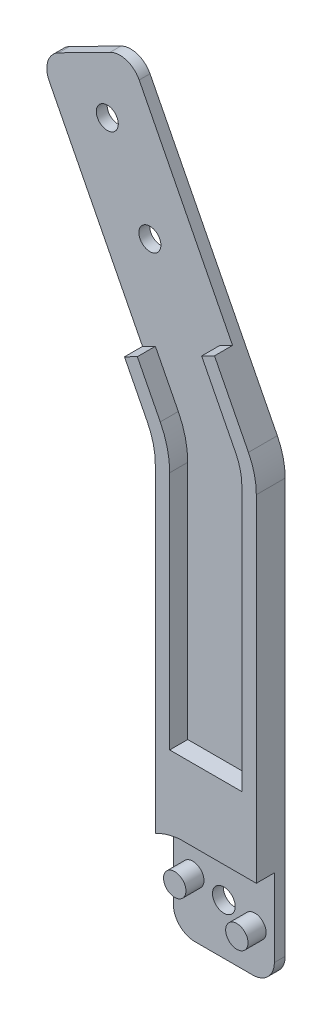
ISO-10303-21;
HEADER;
FILE_DESCRIPTION(('STEP AP214'),'2;1');
FILE_NAME('part.step','',(''),(''),'','','');
FILE_SCHEMA(('AUTOMOTIVE_DESIGN { 1 0 10303 214 1 1 1 1 }'));
ENDSEC;
DATA;
#1=APPLICATION_CONTEXT('core data for automotive mechanical design processes');
#2=APPLICATION_PROTOCOL_DEFINITION('international standard','automotive_design',2000,#1);
#3=PRODUCT_CONTEXT('',#1,'mechanical');
#4=PRODUCT('Part','Part','',(#3));
#5=PRODUCT_RELATED_PRODUCT_CATEGORY('part','',(#4));
#6=PRODUCT_DEFINITION_FORMATION('','',#4);
#7=PRODUCT_DEFINITION_CONTEXT('part definition',#1,'design');
#8=PRODUCT_DEFINITION('design','',#6,#7);
#9=PRODUCT_DEFINITION_SHAPE('','',#8);
#10=(LENGTH_UNIT() NAMED_UNIT(*) SI_UNIT(.MILLI.,.METRE.));
#11=(NAMED_UNIT(*) PLANE_ANGLE_UNIT() SI_UNIT($,.RADIAN.));
#12=(NAMED_UNIT(*) SI_UNIT($,.STERADIAN.) SOLID_ANGLE_UNIT());
#13=UNCERTAINTY_MEASURE_WITH_UNIT(LENGTH_MEASURE(1.E-05),#10,'distance_accuracy_value','');
#14=(GEOMETRIC_REPRESENTATION_CONTEXT(3) GLOBAL_UNCERTAINTY_ASSIGNED_CONTEXT((#13)) GLOBAL_UNIT_ASSIGNED_CONTEXT((#10,
#11,#12)) REPRESENTATION_CONTEXT('',''));
#15=CARTESIAN_POINT('',(0.,0.,0.));
#16=DIRECTION('',(0.,0.,1.));
#17=DIRECTION('',(1.,0.,0.));
#18=AXIS2_PLACEMENT_3D('',#15,#16,#17);
#19=CARTESIAN_POINT('',(0.,0.,1.5));
#20=DIRECTION('',(0.,0.,1.));
#21=DIRECTION('',(1.,0.,0.));
#22=AXIS2_PLACEMENT_3D('',#19,#20,#21);
#23=PLANE('',#22);
#24=CARTESIAN_POINT('',(22.138759595552,51.4926729580468,1.5));
#25=DIRECTION('',(0.,0.,1.));
#26=DIRECTION('',(1.,0.,0.));
#27=AXIS2_PLACEMENT_3D('',#24,#25,#26);
#28=CIRCLE('',#27,1.55);
#29=CARTESIAN_POINT('',(23.688759595552,51.4926729580468,1.5));
#30=VERTEX_POINT('',#29);
#31=EDGE_CURVE('E226',#30,#30,#28,.T.);
#32=ORIENTED_EDGE('',*,*,#31,.F.);
#33=EDGE_LOOP('',(#32));
#34=FACE_BOUND('',#33,.T.);
#35=CARTESIAN_POINT('',(17.8354501109085,52.4568448718525,1.5));
#36=DIRECTION('',(0.,0.,1.));
#37=DIRECTION('',(1.,0.,0.));
#38=AXIS2_PLACEMENT_3D('',#35,#36,#37);
#39=CIRCLE('',#38,1.575);
#40=CARTESIAN_POINT('',(19.4104501109085,52.4568448718525,1.5));
#41=VERTEX_POINT('',#40);
#42=EDGE_CURVE('E256',#41,#41,#39,.T.);
#43=ORIENTED_EDGE('',*,*,#42,.F.);
#44=EDGE_LOOP('',(#43));
#45=FACE_BOUND('',#44,.T.);
#46=CARTESIAN_POINT('',(13.5321406262647,53.4210167856623,1.5));
#47=DIRECTION('',(0.,0.,1.));
#48=DIRECTION('',(1.,0.,0.));
#49=AXIS2_PLACEMENT_3D('',#46,#47,#48);
#50=CIRCLE('',#49,1.55);
#51=CARTESIAN_POINT('',(15.0821406262647,53.4210167856623,1.5));
#52=VERTEX_POINT('',#51);
#53=EDGE_CURVE('E236',#52,#52,#50,.T.);
#54=ORIENTED_EDGE('',*,*,#53,.F.);
#55=EDGE_LOOP('',(#54));
#56=FACE_BOUND('',#55,.T.);
#57=DIRECTION('',(1.,0.,0.));
#58=VECTOR('',#57,1.);
#59=CARTESIAN_POINT('',(24.8354501109084,59.2171124506115,1.5));
#60=LINE('',#59,#58);
#61=CARTESIAN_POINT('',(14.4020012026477,59.2171124506115,1.5));
#62=VERTEX_POINT('',#61);
#63=CARTESIAN_POINT('',(24.8354501109084,59.2171124506115,1.5));
#64=VERTEX_POINT('',#63);
#65=EDGE_CURVE('E50',#62,#64,#60,.T.);
#66=ORIENTED_EDGE('',*,*,#65,.F.);
#67=CARTESIAN_POINT('',(9.53918293556798,51.6023980939841,1.5));
#68=CARTESIAN_POINT('',(8.76047999316748,53.1041844823436,1.5));
#69=CARTESIAN_POINT('',(8.32344941307515,57.7615216555177,1.5));
#70=CARTESIAN_POINT('',(12.7412601634902,59.13858236446,1.5));
#71=CARTESIAN_POINT('',(14.4020012026477,59.2171124506115,1.5));
#72=B_SPLINE_CURVE_WITH_KNOTS('',3,(#67,#68,#69,#70,#71),.UNSPECIFIED.,.F.,.F.,(4,1,4),(0.,
0.50050792490168,1.),.UNSPECIFIED.);
#73=CARTESIAN_POINT('',(10.8354501109083,58.1623408521615,1.5));
#74=VERTEX_POINT('',#73);
#75=EDGE_CURVE('E225',#74,#62,#72,.T.);
#76=ORIENTED_EDGE('',*,*,#75,.F.);
#77=DIRECTION('',(0.,-1.,0.));
#78=VECTOR('',#77,1.);
#79=CARTESIAN_POINT('',(10.8354501109083,45.4568448718525,1.5));
#80=LINE('',#79,#78);
#81=CARTESIAN_POINT('',(10.8354501109083,48.4568448718526,1.5));
#82=VERTEX_POINT('',#81);
#83=EDGE_CURVE('E275',#74,#82,#80,.T.);
#84=ORIENTED_EDGE('',*,*,#83,.T.);
#85=CARTESIAN_POINT('',(13.8354501109083,48.4568448718526,1.5));
#86=DIRECTION('',(0.,0.,1.));
#87=DIRECTION('',(1.,0.,0.));
#88=AXIS2_PLACEMENT_3D('',#85,#86,#87);
#89=CIRCLE('',#88,3.);
#90=CARTESIAN_POINT('',(13.8354501109084,45.4568448718526,1.5));
#91=VERTEX_POINT('',#90);
#92=EDGE_CURVE('E329',#82,#91,#89,.T.);
#93=ORIENTED_EDGE('',*,*,#92,.T.);
#94=DIRECTION('',(1.,0.,0.));
#95=VECTOR('',#94,1.);
#96=CARTESIAN_POINT('',(10.8354501109083,45.4568448718525,1.5));
#97=LINE('',#96,#95);
#98=CARTESIAN_POINT('',(21.8354501109085,45.4568448718527,1.5));
#99=VERTEX_POINT('',#98);
#100=EDGE_CURVE('E262',#91,#99,#97,.T.);
#101=ORIENTED_EDGE('',*,*,#100,.T.);
#102=CARTESIAN_POINT('',(21.8354501109084,48.4568448718527,1.5));
#103=DIRECTION('',(0.,0.,1.));
#104=DIRECTION('',(1.,0.,0.));
#105=AXIS2_PLACEMENT_3D('',#102,#103,#104);
#106=CIRCLE('',#105,3.);
#107=CARTESIAN_POINT('',(24.8354501109084,48.4568448718527,1.5));
#108=VERTEX_POINT('',#107);
#109=EDGE_CURVE('E331',#99,#108,#106,.T.);
#110=ORIENTED_EDGE('',*,*,#109,.T.);
#111=DIRECTION('',(0.,1.,0.));
#112=VECTOR('',#111,1.);
#113=CARTESIAN_POINT('',(24.8354501109084,45.4568448718528,1.5));
#114=LINE('',#113,#112);
#115=EDGE_CURVE('E265',#108,#64,#114,.T.);
#116=ORIENTED_EDGE('',*,*,#115,.T.);
#117=EDGE_LOOP('',(#66,#76,#84,#93,#101,#110,#116));
#118=FACE_BOUND('',#117,.T.);
#119=ADVANCED_FACE('F35',(#34,#45,#56,#118),#23,.T.);
#120=CARTESIAN_POINT('',(7.59061625738334,126.665302464628,1.5));
#121=DIRECTION('',(0.,0.,1.));
#122=DIRECTION('',(1.,0.,0.));
#123=AXIS2_PLACEMENT_3D('',#120,#121,#122);
#124=CIRCLE('',#123,1.52499999999986);
#125=CARTESIAN_POINT('',(9.1156162573832,126.665302464628,1.5));
#126=VERTEX_POINT('',#125);
#127=EDGE_CURVE('E244',#126,#126,#124,.T.);
#128=ORIENTED_EDGE('',*,*,#127,.F.);
#129=EDGE_LOOP('',(#128));
#130=FACE_BOUND('',#129,.T.);
#131=CARTESIAN_POINT('',(1.68873976076937,138.248387279077,1.5));
#132=DIRECTION('',(0.,0.,1.));
#133=DIRECTION('',(1.,0.,0.));
#134=AXIS2_PLACEMENT_3D('',#131,#132,#133);
#135=CIRCLE('',#134,1.52499999999995);
#136=CARTESIAN_POINT('',(3.21373976076932,138.248387279077,1.5));
#137=VERTEX_POINT('',#136);
#138=EDGE_CURVE('E250',#137,#137,#135,.T.);
#139=ORIENTED_EDGE('',*,*,#138,.F.);
#140=EDGE_LOOP('',(#139));
#141=FACE_BOUND('',#140,.T.);
#142=DIRECTION('',(0.453990499739536,-0.891006524188374,0.));
#143=VECTOR('',#142,1.);
#144=CARTESIAN_POINT('',(21.9635023044154,109.47037163722,1.5));
#145=LINE('',#144,#143);
#146=CARTESIAN_POINT('',(17.2596601448759,118.702181675771,1.5));
#147=VERTEX_POINT('',#146);
#148=CARTESIAN_POINT('',(21.9635023044154,109.47037163722,1.5));
#149=VERTEX_POINT('',#148);
#150=EDGE_CURVE('E58',#147,#149,#145,.T.);
#151=ORIENTED_EDGE('',*,*,#150,.F.);
#152=DIRECTION('',(-0.891006524188373,-0.453990499739537,0.));
#153=VECTOR('',#152,1.);
#154=CARTESIAN_POINT('',(17.2596601448759,118.702181675771,1.5));
#155=LINE('',#154,#153);
#156=CARTESIAN_POINT('',(19.0416731932526,119.61016267525,1.5));
#157=VERTEX_POINT('',#156);
#158=EDGE_CURVE('E386',#157,#147,#155,.T.);
#159=ORIENTED_EDGE('',*,*,#158,.F.);
#160=DIRECTION('',(-0.453990499739536,0.891006524188373,0.));
#161=VECTOR('',#160,1.);
#162=CARTESIAN_POINT('',(4.74785193191127,147.663366446572,1.5));
#163=LINE('',#162,#161);
#164=CARTESIAN_POINT('',(6.10982343112988,144.990346874007,1.5));
#165=VERTEX_POINT('',#164);
#166=EDGE_CURVE('E268',#157,#165,#163,.T.);
#167=ORIENTED_EDGE('',*,*,#166,.T.);
#168=CARTESIAN_POINT('',(3.43680385856476,143.628375374789,1.5));
#169=DIRECTION('',(0.,0.,1.));
#170=DIRECTION('',(1.,0.,0.));
#171=AXIS2_PLACEMENT_3D('',#168,#169,#170);
#172=CIRCLE('',#171,3.);
#173=CARTESIAN_POINT('',(2.07483235934615,146.301394947354,1.5));
#174=VERTEX_POINT('',#173);
#175=EDGE_CURVE('E325',#165,#174,#172,.T.);
#176=ORIENTED_EDGE('',*,*,#175,.T.);
#177=DIRECTION('',(-0.891006524188373,-0.453990499739537,0.));
#178=VECTOR('',#177,1.);
#179=CARTESIAN_POINT('',(-7.72623940672607,141.307499450219,1.5));
#180=LINE('',#179,#178);
#181=CARTESIAN_POINT('',(-5.05321983416097,142.669470949437,1.5));
#182=VERTEX_POINT('',#181);
#183=EDGE_CURVE('E270',#174,#182,#180,.T.);
#184=ORIENTED_EDGE('',*,*,#183,.T.);
#185=CARTESIAN_POINT('',(-3.69124833494234,139.996451376872,1.5));
#186=DIRECTION('',(0.,0.,1.));
#187=DIRECTION('',(1.,0.,0.));
#188=AXIS2_PLACEMENT_3D('',#185,#186,#187);
#189=CIRCLE('',#188,3.);
#190=CARTESIAN_POINT('',(-6.36426790750746,138.634479877654,1.5));
#191=VERTEX_POINT('',#190);
#192=EDGE_CURVE('E327',#182,#191,#189,.T.);
#193=ORIENTED_EDGE('',*,*,#192,.T.);
#194=DIRECTION('',(0.453990499739536,-0.891006524188373,0.));
#195=VECTOR('',#194,1.);
#196=CARTESIAN_POINT('',(-7.72623940672607,141.307499450219,1.5));
#197=LINE('',#196,#195);
#198=CARTESIAN_POINT('',(6.56758185461529,113.254295678896,1.5));
#199=VERTEX_POINT('',#198);
#200=EDGE_CURVE('E273',#191,#199,#197,.T.);
#201=ORIENTED_EDGE('',*,*,#200,.T.);
#202=DIRECTION('',(-0.891006524188374,-0.453990499739535,0.));
#203=VECTOR('',#202,1.);
#204=CARTESIAN_POINT('',(6.5675818546153,113.254295678896,1.5));
#205=LINE('',#204,#203);
#206=CARTESIAN_POINT('',(8.34959490299204,114.162276678376,1.5));
#207=VERTEX_POINT('',#206);
#208=EDGE_CURVE('E222',#207,#199,#205,.T.);
#209=ORIENTED_EDGE('',*,*,#208,.F.);
#210=DIRECTION('',(-0.453990499739535,0.891006524188374,0.));
#211=VECTOR('',#210,1.);
#212=CARTESIAN_POINT('',(8.34959490299205,114.162276678376,1.5));
#213=LINE('',#212,#211);
#214=CARTESIAN_POINT('',(11.5275284011688,107.925231009057,1.5));
#215=VERTEX_POINT('',#214);
#216=EDGE_CURVE('E404',#215,#207,#213,.T.);
#217=ORIENTED_EDGE('',*,*,#216,.F.);
#218=CARTESIAN_POINT('',(0.835450110908313,102.477345012182,1.5));
#219=DIRECTION('',(0.,0.,1.));
#220=DIRECTION('',(1.,0.,0.));
#221=AXIS2_PLACEMENT_3D('',#218,#219,#220);
#222=CIRCLE('',#221,12.);
#223=CARTESIAN_POINT('',(12.8354501109083,102.477345012182,1.5));
#224=VERTEX_POINT('',#223);
#225=EDGE_CURVE('E401',#224,#215,#222,.T.);
#226=ORIENTED_EDGE('',*,*,#225,.F.);
#227=DIRECTION('',(0.,1.,0.));
#228=VECTOR('',#227,1.);
#229=CARTESIAN_POINT('',(12.8354501109083,102.477345012182,1.5));
#230=LINE('',#229,#228);
#231=CARTESIAN_POINT('',(12.8354501109083,69.2171124506115,1.5));
#232=VERTEX_POINT('',#231);
#233=EDGE_CURVE('E398',#232,#224,#230,.T.);
#234=ORIENTED_EDGE('',*,*,#233,.F.);
#235=DIRECTION('',(-1.,0.,0.));
#236=VECTOR('',#235,1.);
#237=CARTESIAN_POINT('',(12.8354501109083,69.2171124506115,1.5));
#238=LINE('',#237,#236);
#239=CARTESIAN_POINT('',(22.8354501109084,69.2171124506115,1.5));
#240=VERTEX_POINT('',#239);
#241=EDGE_CURVE('E395',#240,#232,#238,.T.);
#242=ORIENTED_EDGE('',*,*,#241,.F.);
#243=DIRECTION('',(0.,-1.,0.));
#244=VECTOR('',#243,1.);
#245=CARTESIAN_POINT('',(22.8354501109084,69.2171124506115,1.5));
#246=LINE('',#245,#244);
#247=CARTESIAN_POINT('',(22.8354501109084,105.838447639304,1.5));
#248=VERTEX_POINT('',#247);
#249=EDGE_CURVE('E392',#248,#240,#246,.T.);
#250=ORIENTED_EDGE('',*,*,#249,.F.);
#251=CARTESIAN_POINT('',(14.8354501109084,105.838447639304,1.5));
#252=DIRECTION('',(0.,0.,-1.));
#253=DIRECTION('',(1.,0.,0.));
#254=AXIS2_PLACEMENT_3D('',#251,#252,#253);
#255=CIRCLE('',#254,8.);
#256=EDGE_CURVE('E389',#149,#248,#255,.T.);
#257=ORIENTED_EDGE('',*,*,#256,.F.);
#258=EDGE_LOOP('',(#151,#159,#167,#176,#184,#193,#201,#209,#217,#226,#234,#242,#250,#257));
#259=FACE_BOUND('',#258,.T.);
#260=ADVANCED_FACE('F348',(#130,#141,#259),#23,.T.);
#261=CARTESIAN_POINT('',(0.,0.,0.));
#262=DIRECTION('',(0.,0.,1.));
#263=DIRECTION('',(1.,0.,0.));
#264=AXIS2_PLACEMENT_3D('',#261,#262,#263);
#265=PLANE('',#264);
#266=CARTESIAN_POINT('',(1.68873976076937,138.248387279077,0.));
#267=DIRECTION('',(0.,0.,1.));
#268=DIRECTION('',(1.,0.,0.));
#269=AXIS2_PLACEMENT_3D('',#266,#267,#268);
#270=CIRCLE('',#269,1.52499999999995);
#271=CARTESIAN_POINT('',(3.21373976076932,138.248387279077,0.));
#272=VERTEX_POINT('',#271);
#273=EDGE_CURVE('E247',#272,#272,#270,.T.);
#274=ORIENTED_EDGE('',*,*,#273,.T.);
#275=EDGE_LOOP('',(#274));
#276=FACE_BOUND('',#275,.T.);
#277=DIRECTION('',(-0.453990499739536,0.891006524188373,0.));
#278=VECTOR('',#277,1.);
#279=CARTESIAN_POINT('',(4.74785193191127,147.663366446572,0.));
#280=LINE('',#279,#278);
#281=CARTESIAN_POINT('',(23.7455153527922,110.378352636699,0.));
#282=VERTEX_POINT('',#281);
#283=CARTESIAN_POINT('',(6.10982343112988,144.990346874007,0.));
#284=VERTEX_POINT('',#283);
#285=EDGE_CURVE('E283',#282,#284,#280,.T.);
#286=ORIENTED_EDGE('',*,*,#285,.F.);
#287=CARTESIAN_POINT('',(14.8354501109084,105.838447639304,0.));
#288=DIRECTION('',(0.,0.,1.));
#289=DIRECTION('',(1.,0.,0.));
#290=AXIS2_PLACEMENT_3D('',#287,#288,#289);
#291=CIRCLE('',#290,10.);
#292=CARTESIAN_POINT('',(24.8354501109084,105.838447639304,0.));
#293=VERTEX_POINT('',#292);
#294=EDGE_CURVE('E318',#282,#293,#291,.F.);
#295=ORIENTED_EDGE('',*,*,#294,.T.);
#296=DIRECTION('',(0.,1.,0.));
#297=VECTOR('',#296,1.);
#298=CARTESIAN_POINT('',(24.8354501109084,45.4568448718528,0.));
#299=LINE('',#298,#297);
#300=CARTESIAN_POINT('',(24.8354501109084,48.4568448718527,0.));
#301=VERTEX_POINT('',#300);
#302=EDGE_CURVE('E280',#301,#293,#299,.T.);
#303=ORIENTED_EDGE('',*,*,#302,.F.);
#304=CARTESIAN_POINT('',(21.8354501109084,48.4568448718527,0.));
#305=DIRECTION('',(0.,0.,1.));
#306=DIRECTION('',(1.,0.,0.));
#307=AXIS2_PLACEMENT_3D('',#304,#305,#306);
#308=CIRCLE('',#307,3.);
#309=CARTESIAN_POINT('',(21.8354501109085,45.4568448718527,0.));
#310=VERTEX_POINT('',#309);
#311=EDGE_CURVE('E316',#301,#310,#308,.F.);
#312=ORIENTED_EDGE('',*,*,#311,.T.);
#313=DIRECTION('',(1.,0.,0.));
#314=VECTOR('',#313,1.);
#315=CARTESIAN_POINT('',(10.8354501109083,45.4568448718525,0.));
#316=LINE('',#315,#314);
#317=CARTESIAN_POINT('',(13.8354501109084,45.4568448718526,0.));
#318=VERTEX_POINT('',#317);
#319=EDGE_CURVE('E259',#318,#310,#316,.T.);
#320=ORIENTED_EDGE('',*,*,#319,.F.);
#321=CARTESIAN_POINT('',(13.8354501109083,48.4568448718526,0.));
#322=DIRECTION('',(0.,0.,1.));
#323=DIRECTION('',(1.,0.,0.));
#324=AXIS2_PLACEMENT_3D('',#321,#322,#323);
#325=CIRCLE('',#324,3.);
#326=CARTESIAN_POINT('',(10.8354501109083,48.4568448718526,0.));
#327=VERTEX_POINT('',#326);
#328=EDGE_CURVE('E314',#318,#327,#325,.F.);
#329=ORIENTED_EDGE('',*,*,#328,.T.);
#330=DIRECTION('',(0.,-1.,0.));
#331=VECTOR('',#330,1.);
#332=CARTESIAN_POINT('',(10.8354501109083,45.4568448718525,0.));
#333=LINE('',#332,#331);
#334=CARTESIAN_POINT('',(10.8354501109083,102.477345012182,0.));
#335=VERTEX_POINT('',#334);
#336=EDGE_CURVE('E266',#335,#327,#333,.T.);
#337=ORIENTED_EDGE('',*,*,#336,.F.);
#338=CARTESIAN_POINT('',(0.835450110908313,102.477345012182,0.));
#339=DIRECTION('',(0.,0.,1.));
#340=DIRECTION('',(1.,0.,0.));
#341=AXIS2_PLACEMENT_3D('',#338,#339,#340);
#342=CIRCLE('',#341,10.);
#343=CARTESIAN_POINT('',(9.74551535279205,107.017250009578,0.));
#344=VERTEX_POINT('',#343);
#345=EDGE_CURVE('E12',#335,#344,#342,.T.);
#346=ORIENTED_EDGE('',*,*,#345,.T.);
#347=DIRECTION('',(0.453990499739536,-0.891006524188373,0.));
#348=VECTOR('',#347,1.);
#349=CARTESIAN_POINT('',(-7.72623940672607,141.307499450219,0.));
#350=LINE('',#349,#348);
#351=CARTESIAN_POINT('',(-6.36426790750746,138.634479877654,0.));
#352=VERTEX_POINT('',#351);
#353=EDGE_CURVE('E289',#352,#344,#350,.T.);
#354=ORIENTED_EDGE('',*,*,#353,.F.);
#355=CARTESIAN_POINT('',(-3.69124833494234,139.996451376872,0.));
#356=DIRECTION('',(0.,0.,1.));
#357=DIRECTION('',(1.,0.,0.));
#358=AXIS2_PLACEMENT_3D('',#355,#356,#357);
#359=CIRCLE('',#358,3.);
#360=CARTESIAN_POINT('',(-5.05321983416097,142.669470949437,0.));
#361=VERTEX_POINT('',#360);
#362=EDGE_CURVE('E312',#352,#361,#359,.F.);
#363=ORIENTED_EDGE('',*,*,#362,.T.);
#364=DIRECTION('',(-0.891006524188373,-0.453990499739537,0.));
#365=VECTOR('',#364,1.);
#366=CARTESIAN_POINT('',(-7.72623940672607,141.307499450219,0.));
#367=LINE('',#366,#365);
#368=CARTESIAN_POINT('',(2.07483235934615,146.301394947354,0.));
#369=VERTEX_POINT('',#368);
#370=EDGE_CURVE('E286',#369,#361,#367,.T.);
#371=ORIENTED_EDGE('',*,*,#370,.F.);
#372=CARTESIAN_POINT('',(3.43680385856476,143.628375374789,0.));
#373=DIRECTION('',(0.,0.,1.));
#374=DIRECTION('',(1.,0.,0.));
#375=AXIS2_PLACEMENT_3D('',#372,#373,#374);
#376=CIRCLE('',#375,3.);
#377=EDGE_CURVE('E310',#369,#284,#376,.F.);
#378=ORIENTED_EDGE('',*,*,#377,.T.);
#379=EDGE_LOOP('',(#286,#295,#303,#312,#320,#329,#337,#346,#354,#363,#371,#378));
#380=FACE_BOUND('',#379,.T.);
#381=CARTESIAN_POINT('',(17.8354501109085,52.4568448718525,0.));
#382=DIRECTION('',(0.,0.,1.));
#383=DIRECTION('',(1.,0.,0.));
#384=AXIS2_PLACEMENT_3D('',#381,#382,#383);
#385=CIRCLE('',#384,1.575);
#386=CARTESIAN_POINT('',(19.4104501109085,52.4568448718525,0.));
#387=VERTEX_POINT('',#386);
#388=EDGE_CURVE('E253',#387,#387,#385,.T.);
#389=ORIENTED_EDGE('',*,*,#388,.T.);
#390=EDGE_LOOP('',(#389));
#391=FACE_BOUND('',#390,.T.);
#392=CARTESIAN_POINT('',(7.59061625738334,126.665302464628,0.));
#393=DIRECTION('',(0.,0.,1.));
#394=DIRECTION('',(1.,0.,0.));
#395=AXIS2_PLACEMENT_3D('',#392,#393,#394);
#396=CIRCLE('',#395,1.52499999999986);
#397=CARTESIAN_POINT('',(9.1156162573832,126.665302464628,0.));
#398=VERTEX_POINT('',#397);
#399=EDGE_CURVE('E241',#398,#398,#396,.T.);
#400=ORIENTED_EDGE('',*,*,#399,.T.);
#401=EDGE_LOOP('',(#400));
#402=FACE_BOUND('',#401,.T.);
#403=ADVANCED_FACE('F360',(#276,#380,#391,#402),#265,.F.);
#404=CARTESIAN_POINT('',(10.8354501109083,45.4568448718525,1.5));
#405=DIRECTION('',(0.,1.,0.));
#406=DIRECTION('',(-1.,0.,0.));
#407=AXIS2_PLACEMENT_3D('',#404,#405,#406);
#408=PLANE('',#407);
#409=ORIENTED_EDGE('',*,*,#319,.T.);
#410=DIRECTION('',(0.,0.,-1.));
#411=VECTOR('',#410,1.);
#412=CARTESIAN_POINT('',(21.8354501109085,45.4568448718527,1.5));
#413=LINE('',#412,#411);
#414=EDGE_CURVE('E336',#310,#99,#413,.F.);
#415=ORIENTED_EDGE('',*,*,#414,.T.);
#416=ORIENTED_EDGE('',*,*,#100,.F.);
#417=DIRECTION('',(0.,0.,-1.));
#418=VECTOR('',#417,1.);
#419=CARTESIAN_POINT('',(13.8354501109084,45.4568448718526,1.5));
#420=LINE('',#419,#418);
#421=EDGE_CURVE('E333',#91,#318,#420,.T.);
#422=ORIENTED_EDGE('',*,*,#421,.T.);
#423=EDGE_LOOP('',(#409,#415,#416,#422));
#424=FACE_BOUND('',#423,.T.);
#425=ADVANCED_FACE('F536',(#424),#408,.F.);
#426=CARTESIAN_POINT('',(24.8354501109084,45.4568448718528,1.5));
#427=DIRECTION('',(-1.,0.,0.));
#428=DIRECTION('',(0.,-1.,0.));
#429=AXIS2_PLACEMENT_3D('',#426,#427,#428);
#430=PLANE('',#429);
#431=ORIENTED_EDGE('',*,*,#302,.T.);
#432=DIRECTION('',(0.,0.,-1.));
#433=VECTOR('',#432,1.);
#434=CARTESIAN_POINT('',(24.8354501109084,105.838447639304,1.5));
#435=LINE('',#434,#433);
#436=CARTESIAN_POINT('',(24.8354501109084,105.838447639304,4.));
#437=VERTEX_POINT('',#436);
#438=EDGE_CURVE('E323',#293,#437,#435,.F.);
#439=ORIENTED_EDGE('',*,*,#438,.T.);
#440=DIRECTION('',(0.,1.,0.));
#441=VECTOR('',#440,1.);
#442=CARTESIAN_POINT('',(24.8354501109084,59.2171124506115,4.));
#443=LINE('',#442,#441);
#444=CARTESIAN_POINT('',(24.8354501109084,59.2171124506115,4.));
#445=VERTEX_POINT('',#444);
#446=EDGE_CURVE('E211',#445,#437,#443,.T.);
#447=ORIENTED_EDGE('',*,*,#446,.F.);
#448=DIRECTION('',(0.,0.,-1.));
#449=VECTOR('',#448,1.);
#450=CARTESIAN_POINT('',(24.8354501109084,59.2171124506115,4.));
#451=LINE('',#450,#449);
#452=EDGE_CURVE('E207',#445,#64,#451,.T.);
#453=ORIENTED_EDGE('',*,*,#452,.T.);
#454=ORIENTED_EDGE('',*,*,#115,.F.);
#455=DIRECTION('',(0.,0.,-1.));
#456=VECTOR('',#455,1.);
#457=CARTESIAN_POINT('',(24.8354501109084,48.4568448718527,1.5));
#458=LINE('',#457,#456);
#459=EDGE_CURVE('E320',#108,#301,#458,.T.);
#460=ORIENTED_EDGE('',*,*,#459,.T.);
#461=EDGE_LOOP('',(#431,#439,#447,#453,#454,#460));
#462=FACE_BOUND('',#461,.T.);
#463=ADVANCED_FACE('F451',(#462),#430,.F.);
#464=CARTESIAN_POINT('',(4.74785193191127,147.663366446572,1.5));
#465=DIRECTION('',(-0.891006524188373,-0.453990499739536,0.));
#466=DIRECTION('',(0.453990499739536,-0.891006524188373,0.));
#467=AXIS2_PLACEMENT_3D('',#464,#465,#466);
#468=PLANE('',#467);
#469=ORIENTED_EDGE('',*,*,#166,.F.);
#470=DIRECTION('',(0.,0.,-1.));
#471=VECTOR('',#470,1.);
#472=CARTESIAN_POINT('',(19.0416731932526,119.61016267525,4.));
#473=LINE('',#472,#471);
#474=CARTESIAN_POINT('',(19.0416731932526,119.61016267525,4.));
#475=VERTEX_POINT('',#474);
#476=EDGE_CURVE('E231',#475,#157,#473,.T.);
#477=ORIENTED_EDGE('',*,*,#476,.F.);
#478=DIRECTION('',(-0.453990499739536,0.891006524188373,0.));
#479=VECTOR('',#478,1.);
#480=CARTESIAN_POINT('',(23.7455153527922,110.378352636699,4.));
#481=LINE('',#480,#479);
#482=CARTESIAN_POINT('',(23.7455153527922,110.378352636699,4.));
#483=VERTEX_POINT('',#482);
#484=EDGE_CURVE('E444',#483,#475,#481,.T.);
#485=ORIENTED_EDGE('',*,*,#484,.F.);
#486=DIRECTION('',(0.,0.,-1.));
#487=VECTOR('',#486,1.);
#488=CARTESIAN_POINT('',(23.7455153527922,110.378352636699,1.5));
#489=LINE('',#488,#487);
#490=EDGE_CURVE('E307',#483,#282,#489,.T.);
#491=ORIENTED_EDGE('',*,*,#490,.T.);
#492=ORIENTED_EDGE('',*,*,#285,.T.);
#493=DIRECTION('',(0.,0.,-1.));
#494=VECTOR('',#493,1.);
#495=CARTESIAN_POINT('',(6.10982343112988,144.990346874007,1.5));
#496=LINE('',#495,#494);
#497=EDGE_CURVE('E304',#284,#165,#496,.F.);
#498=ORIENTED_EDGE('',*,*,#497,.T.);
#499=EDGE_LOOP('',(#469,#477,#485,#491,#492,#498));
#500=FACE_BOUND('',#499,.T.);
#501=ADVANCED_FACE('F443',(#500),#468,.F.);
#502=CARTESIAN_POINT('',(-7.72623940672607,141.307499450219,1.5));
#503=DIRECTION('',(0.453990499739537,-0.891006524188373,0.));
#504=DIRECTION('',(0.891006524188373,0.453990499739537,0.));
#505=AXIS2_PLACEMENT_3D('',#502,#503,#504);
#506=PLANE('',#505);
#507=ORIENTED_EDGE('',*,*,#370,.T.);
#508=DIRECTION('',(0.,0.,-1.));
#509=VECTOR('',#508,1.);
#510=CARTESIAN_POINT('',(-5.05321983416097,142.669470949437,1.5));
#511=LINE('',#510,#509);
#512=EDGE_CURVE('E43',#361,#182,#511,.F.);
#513=ORIENTED_EDGE('',*,*,#512,.T.);
#514=ORIENTED_EDGE('',*,*,#183,.F.);
#515=DIRECTION('',(0.,0.,-1.));
#516=VECTOR('',#515,1.);
#517=CARTESIAN_POINT('',(2.07483235934615,146.301394947354,1.5));
#518=LINE('',#517,#516);
#519=EDGE_CURVE('E338',#174,#369,#518,.T.);
#520=ORIENTED_EDGE('',*,*,#519,.T.);
#521=EDGE_LOOP('',(#507,#513,#514,#520));
#522=FACE_BOUND('',#521,.T.);
#523=ADVANCED_FACE('F343',(#522),#506,.F.);
#524=CARTESIAN_POINT('',(-7.72623940672607,141.307499450219,1.5));
#525=DIRECTION('',(0.891006524188373,0.453990499739536,0.));
#526=DIRECTION('',(-0.453990499739536,0.891006524188373,0.));
#527=AXIS2_PLACEMENT_3D('',#524,#525,#526);
#528=PLANE('',#527);
#529=ORIENTED_EDGE('',*,*,#353,.T.);
#530=DIRECTION('',(0.,0.,-1.));
#531=VECTOR('',#530,1.);
#532=CARTESIAN_POINT('',(9.74551535279205,107.017250009578,1.5));
#533=LINE('',#532,#531);
#534=CARTESIAN_POINT('',(9.74551535279205,107.017250009578,4.));
#535=VERTEX_POINT('',#534);
#536=EDGE_CURVE('E302',#344,#535,#533,.F.);
#537=ORIENTED_EDGE('',*,*,#536,.T.);
#538=DIRECTION('',(0.453990499739536,-0.891006524188373,0.));
#539=VECTOR('',#538,1.);
#540=CARTESIAN_POINT('',(6.5675818546153,113.254295678896,4.));
#541=LINE('',#540,#539);
#542=CARTESIAN_POINT('',(6.5675818546153,113.254295678896,4.));
#543=VERTEX_POINT('',#542);
#544=EDGE_CURVE('E375',#543,#535,#541,.T.);
#545=ORIENTED_EDGE('',*,*,#544,.F.);
#546=DIRECTION('',(0.,0.,-1.));
#547=VECTOR('',#546,1.);
#548=CARTESIAN_POINT('',(6.5675818546153,113.254295678896,4.));
#549=LINE('',#548,#547);
#550=EDGE_CURVE('E373',#543,#199,#549,.T.);
#551=ORIENTED_EDGE('',*,*,#550,.T.);
#552=ORIENTED_EDGE('',*,*,#200,.F.);
#553=DIRECTION('',(0.,0.,-1.));
#554=VECTOR('',#553,1.);
#555=CARTESIAN_POINT('',(-6.36426790750746,138.634479877654,1.5));
#556=LINE('',#555,#554);
#557=EDGE_CURVE('E299',#191,#352,#556,.T.);
#558=ORIENTED_EDGE('',*,*,#557,.T.);
#559=EDGE_LOOP('',(#529,#537,#545,#551,#552,#558));
#560=FACE_BOUND('',#559,.T.);
#561=ADVANCED_FACE('F355',(#560),#528,.F.);
#562=CARTESIAN_POINT('',(10.8354501109083,45.4568448718525,1.5));
#563=DIRECTION('',(1.,0.,0.));
#564=DIRECTION('',(0.,1.,0.));
#565=AXIS2_PLACEMENT_3D('',#562,#563,#564);
#566=PLANE('',#565);
#567=ORIENTED_EDGE('',*,*,#83,.F.);
#568=DIRECTION('',(0.,0.,-1.));
#569=VECTOR('',#568,1.);
#570=CARTESIAN_POINT('',(10.8354501109085,58.1623408521615,4.));
#571=LINE('',#570,#569);
#572=CARTESIAN_POINT('',(10.8354501109085,58.1623408521615,4.));
#573=VERTEX_POINT('',#572);
#574=EDGE_CURVE('E370',#573,#74,#571,.T.);
#575=ORIENTED_EDGE('',*,*,#574,.F.);
#576=DIRECTION('',(0.,-1.,0.));
#577=VECTOR('',#576,1.);
#578=CARTESIAN_POINT('',(10.8354501109083,102.477345012182,4.));
#579=LINE('',#578,#577);
#580=CARTESIAN_POINT('',(10.8354501109083,102.477345012182,4.));
#581=VERTEX_POINT('',#580);
#582=EDGE_CURVE('E218',#581,#573,#579,.T.);
#583=ORIENTED_EDGE('',*,*,#582,.F.);
#584=DIRECTION('',(0.,0.,-1.));
#585=VECTOR('',#584,1.);
#586=CARTESIAN_POINT('',(10.8354501109083,102.477345012182,0.));
#587=LINE('',#586,#585);
#588=EDGE_CURVE('E296',#581,#335,#587,.T.);
#589=ORIENTED_EDGE('',*,*,#588,.T.);
#590=ORIENTED_EDGE('',*,*,#336,.T.);
#591=DIRECTION('',(0.,0.,-1.));
#592=VECTOR('',#591,1.);
#593=CARTESIAN_POINT('',(10.8354501109083,48.4568448718526,1.5));
#594=LINE('',#593,#592);
#595=EDGE_CURVE('E277',#327,#82,#594,.F.);
#596=ORIENTED_EDGE('',*,*,#595,.T.);
#597=EDGE_LOOP('',(#567,#575,#583,#589,#590,#596));
#598=FACE_BOUND('',#597,.T.);
#599=ADVANCED_FACE('F368',(#598),#566,.F.);
#600=CARTESIAN_POINT('',(17.8354501109085,52.4568448718525,1.5));
#601=DIRECTION('',(0.,0.,-1.));
#602=DIRECTION('',(-1.,0.,0.));
#603=AXIS2_PLACEMENT_3D('',#600,#601,#602);
#604=CYLINDRICAL_SURFACE('',#603,1.575);
#605=ORIENTED_EDGE('',*,*,#42,.T.);
#606=EDGE_LOOP('',(#605));
#607=FACE_BOUND('',#606,.T.);
#608=ORIENTED_EDGE('',*,*,#388,.F.);
#609=EDGE_LOOP('',(#608));
#610=FACE_BOUND('',#609,.T.);
#611=ADVANCED_FACE('F532',(#607,#610),#604,.F.);
#612=CARTESIAN_POINT('',(1.68873976076937,138.248387279077,1.5));
#613=DIRECTION('',(0.,0.,-1.));
#614=DIRECTION('',(-1.,0.,0.));
#615=AXIS2_PLACEMENT_3D('',#612,#613,#614);
#616=CYLINDRICAL_SURFACE('',#615,1.52499999999995);
#617=ORIENTED_EDGE('',*,*,#138,.T.);
#618=EDGE_LOOP('',(#617));
#619=FACE_BOUND('',#618,.T.);
#620=ORIENTED_EDGE('',*,*,#273,.F.);
#621=EDGE_LOOP('',(#620));
#622=FACE_BOUND('',#621,.T.);
#623=ADVANCED_FACE('F585',(#619,#622),#616,.F.);
#624=CARTESIAN_POINT('',(7.59061625738334,126.665302464628,1.5));
#625=DIRECTION('',(0.,0.,-1.));
#626=DIRECTION('',(-1.,0.,0.));
#627=AXIS2_PLACEMENT_3D('',#624,#625,#626);
#628=CYLINDRICAL_SURFACE('',#627,1.52499999999986);
#629=ORIENTED_EDGE('',*,*,#127,.T.);
#630=EDGE_LOOP('',(#629));
#631=FACE_BOUND('',#630,.T.);
#632=ORIENTED_EDGE('',*,*,#399,.F.);
#633=EDGE_LOOP('',(#632));
#634=FACE_BOUND('',#633,.T.);
#635=ADVANCED_FACE('F553',(#631,#634),#628,.F.);
#636=CARTESIAN_POINT('',(0.835450110908313,102.477345012182,1.5));
#637=DIRECTION('',(0.,0.,1.));
#638=DIRECTION('',(1.,0.,0.));
#639=AXIS2_PLACEMENT_3D('',#636,#637,#638);
#640=CYLINDRICAL_SURFACE('',#639,10.);
#641=ORIENTED_EDGE('',*,*,#588,.F.);
#642=CARTESIAN_POINT('',(0.835450110908313,102.477345012182,4.));
#643=DIRECTION('',(0.,0.,-1.));
#644=DIRECTION('',(1.,0.,0.));
#645=AXIS2_PLACEMENT_3D('',#642,#643,#644);
#646=CIRCLE('',#645,9.99999999999999);
#647=EDGE_CURVE('E371',#535,#581,#646,.T.);
#648=ORIENTED_EDGE('',*,*,#647,.F.);
#649=ORIENTED_EDGE('',*,*,#536,.F.);
#650=ORIENTED_EDGE('',*,*,#345,.F.);
#651=EDGE_LOOP('',(#641,#648,#649,#650));
#652=FACE_BOUND('',#651,.T.);
#653=ADVANCED_FACE('F364',(#652),#640,.F.);
#654=CARTESIAN_POINT('',(14.8354501109084,105.838447639304,1.5));
#655=DIRECTION('',(0.,0.,-1.));
#656=DIRECTION('',(-1.,0.,0.));
#657=AXIS2_PLACEMENT_3D('',#654,#655,#656);
#658=CYLINDRICAL_SURFACE('',#657,10.);
#659=ORIENTED_EDGE('',*,*,#490,.F.);
#660=CARTESIAN_POINT('',(14.8354501109084,105.838447639304,4.));
#661=DIRECTION('',(0.,0.,1.));
#662=DIRECTION('',(1.,0.,0.));
#663=AXIS2_PLACEMENT_3D('',#660,#661,#662);
#664=CIRCLE('',#663,10.);
#665=EDGE_CURVE('E457',#437,#483,#664,.T.);
#666=ORIENTED_EDGE('',*,*,#665,.F.);
#667=ORIENTED_EDGE('',*,*,#438,.F.);
#668=ORIENTED_EDGE('',*,*,#294,.F.);
#669=EDGE_LOOP('',(#659,#666,#667,#668));
#670=FACE_BOUND('',#669,.T.);
#671=ADVANCED_FACE('F455',(#670),#658,.T.);
#672=CARTESIAN_POINT('',(21.8354501109084,48.4568448718527,1.5));
#673=DIRECTION('',(0.,0.,-1.));
#674=DIRECTION('',(-1.,0.,0.));
#675=AXIS2_PLACEMENT_3D('',#672,#673,#674);
#676=CYLINDRICAL_SURFACE('',#675,3.);
#677=ORIENTED_EDGE('',*,*,#109,.F.);
#678=ORIENTED_EDGE('',*,*,#414,.F.);
#679=ORIENTED_EDGE('',*,*,#311,.F.);
#680=ORIENTED_EDGE('',*,*,#459,.F.);
#681=EDGE_LOOP('',(#677,#678,#679,#680));
#682=FACE_BOUND('',#681,.T.);
#683=ADVANCED_FACE('F556',(#682),#676,.T.);
#684=CARTESIAN_POINT('',(13.8354501109083,48.4568448718526,1.5));
#685=DIRECTION('',(0.,0.,-1.));
#686=DIRECTION('',(-1.,0.,0.));
#687=AXIS2_PLACEMENT_3D('',#684,#685,#686);
#688=CYLINDRICAL_SURFACE('',#687,3.);
#689=ORIENTED_EDGE('',*,*,#92,.F.);
#690=ORIENTED_EDGE('',*,*,#595,.F.);
#691=ORIENTED_EDGE('',*,*,#328,.F.);
#692=ORIENTED_EDGE('',*,*,#421,.F.);
#693=EDGE_LOOP('',(#689,#690,#691,#692));
#694=FACE_BOUND('',#693,.T.);
#695=ADVANCED_FACE('F559',(#694),#688,.T.);
#696=CARTESIAN_POINT('',(-3.69124833494234,139.996451376872,1.5));
#697=DIRECTION('',(0.,0.,-1.));
#698=DIRECTION('',(-1.,0.,0.));
#699=AXIS2_PLACEMENT_3D('',#696,#697,#698);
#700=CYLINDRICAL_SURFACE('',#699,3.);
#701=ORIENTED_EDGE('',*,*,#192,.F.);
#702=ORIENTED_EDGE('',*,*,#512,.F.);
#703=ORIENTED_EDGE('',*,*,#362,.F.);
#704=ORIENTED_EDGE('',*,*,#557,.F.);
#705=EDGE_LOOP('',(#701,#702,#703,#704));
#706=FACE_BOUND('',#705,.T.);
#707=ADVANCED_FACE('F352',(#706),#700,.T.);
#708=CARTESIAN_POINT('',(3.43680385856476,143.628375374789,1.5));
#709=DIRECTION('',(0.,0.,-1.));
#710=DIRECTION('',(-1.,0.,0.));
#711=AXIS2_PLACEMENT_3D('',#708,#709,#710);
#712=CYLINDRICAL_SURFACE('',#711,3.);
#713=ORIENTED_EDGE('',*,*,#175,.F.);
#714=ORIENTED_EDGE('',*,*,#497,.F.);
#715=ORIENTED_EDGE('',*,*,#377,.F.);
#716=ORIENTED_EDGE('',*,*,#519,.F.);
#717=EDGE_LOOP('',(#713,#714,#715,#716));
#718=FACE_BOUND('',#717,.T.);
#719=ADVANCED_FACE('F37',(#718),#712,.T.);
#720=CARTESIAN_POINT('',(13.5321406262647,53.4210167856623,4.));
#721=DIRECTION('',(0.,0.,-1.));
#722=DIRECTION('',(-1.,0.,0.));
#723=AXIS2_PLACEMENT_3D('',#720,#721,#722);
#724=CYLINDRICAL_SURFACE('',#723,1.55);
#725=CARTESIAN_POINT('',(13.5321406262647,53.4210167856623,4.));
#726=DIRECTION('',(0.,0.,1.));
#727=DIRECTION('',(1.,0.,0.));
#728=AXIS2_PLACEMENT_3D('',#725,#726,#727);
#729=CIRCLE('',#728,1.55);
#730=CARTESIAN_POINT('',(15.0821406262647,53.4210167856623,4.));
#731=VERTEX_POINT('',#730);
#732=EDGE_CURVE('E238',#731,#731,#729,.T.);
#733=ORIENTED_EDGE('',*,*,#732,.F.);
#734=EDGE_LOOP('',(#733));
#735=FACE_BOUND('',#734,.T.);
#736=ORIENTED_EDGE('',*,*,#53,.T.);
#737=EDGE_LOOP('',(#736));
#738=FACE_BOUND('',#737,.T.);
#739=ADVANCED_FACE('F567',(#735,#738),#724,.T.);
#740=CARTESIAN_POINT('',(13.5321406262647,53.4210167856623,4.));
#741=DIRECTION('',(0.,0.,1.));
#742=DIRECTION('',(1.,0.,0.));
#743=AXIS2_PLACEMENT_3D('',#740,#741,#742);
#744=PLANE('',#743);
#745=ORIENTED_EDGE('',*,*,#732,.T.);
#746=EDGE_LOOP('',(#745));
#747=FACE_BOUND('',#746,.T.);
#748=ADVANCED_FACE('F571',(#747),#744,.T.);
#749=CARTESIAN_POINT('',(22.138759595552,51.4926729580468,4.));
#750=DIRECTION('',(0.,0.,-1.));
#751=DIRECTION('',(-1.,0.,0.));
#752=AXIS2_PLACEMENT_3D('',#749,#750,#751);
#753=CYLINDRICAL_SURFACE('',#752,1.55);
#754=CARTESIAN_POINT('',(22.138759595552,51.4926729580468,4.));
#755=DIRECTION('',(0.,0.,1.));
#756=DIRECTION('',(1.,0.,0.));
#757=AXIS2_PLACEMENT_3D('',#754,#755,#756);
#758=CIRCLE('',#757,1.55);
#759=CARTESIAN_POINT('',(23.688759595552,51.4926729580468,4.));
#760=VERTEX_POINT('',#759);
#761=EDGE_CURVE('E229',#760,#760,#758,.T.);
#762=ORIENTED_EDGE('',*,*,#761,.F.);
#763=EDGE_LOOP('',(#762));
#764=FACE_BOUND('',#763,.T.);
#765=ORIENTED_EDGE('',*,*,#31,.T.);
#766=EDGE_LOOP('',(#765));
#767=FACE_BOUND('',#766,.T.);
#768=ADVANCED_FACE('F577',(#764,#767),#753,.T.);
#769=CARTESIAN_POINT('',(22.138759595552,51.4926729580468,4.));
#770=DIRECTION('',(0.,0.,1.));
#771=DIRECTION('',(1.,0.,0.));
#772=AXIS2_PLACEMENT_3D('',#769,#770,#771);
#773=PLANE('',#772);
#774=ORIENTED_EDGE('',*,*,#761,.T.);
#775=EDGE_LOOP('',(#774));
#776=FACE_BOUND('',#775,.T.);
#777=ADVANCED_FACE('F683',(#776),#773,.T.);
#778=CARTESIAN_POINT('',(9.53918293556798,51.6023980939841,4.));
#779=CARTESIAN_POINT('',(8.76047999316748,53.1041844823436,4.));
#780=CARTESIAN_POINT('',(8.32344941307515,57.7615216555177,4.));
#781=CARTESIAN_POINT('',(12.7412601634902,59.13858236446,4.));
#782=CARTESIAN_POINT('',(14.4020012026477,59.2171124506115,4.));
#783=B_SPLINE_CURVE_WITH_KNOTS('',3,(#778,#779,#780,#781,#782),.UNSPECIFIED.,.F.,.F.,(4,1,4),
(0.,0.50050792490168,1.),.UNSPECIFIED.);
#784=DIRECTION('',(0.,0.,-1.));
#785=VECTOR('',#784,1.);
#786=SURFACE_OF_LINEAR_EXTRUSION('',#783,#785);
#787=ORIENTED_EDGE('',*,*,#75,.T.);
#788=DIRECTION('',(0.,0.,-1.));
#789=VECTOR('',#788,1.);
#790=CARTESIAN_POINT('',(14.4020012026477,59.2171124506115,4.));
#791=LINE('',#790,#789);
#792=CARTESIAN_POINT('',(14.4020012026477,59.2171124506115,4.));
#793=VERTEX_POINT('',#792);
#794=EDGE_CURVE('E204',#793,#62,#791,.T.);
#795=ORIENTED_EDGE('',*,*,#794,.F.);
#796=EDGE_CURVE('E212',#573,#793,#783,.T.);
#797=ORIENTED_EDGE('',*,*,#796,.F.);
#798=ORIENTED_EDGE('',*,*,#574,.T.);
#799=EDGE_LOOP('',(#787,#795,#797,#798));
#800=FACE_BOUND('',#799,.T.);
#801=ADVANCED_FACE('F224',(#800),#786,.F.);
#802=CARTESIAN_POINT('',(24.8354501109084,59.2171124506115,4.));
#803=DIRECTION('',(0.,1.,0.));
#804=DIRECTION('',(0.,0.,1.));
#805=AXIS2_PLACEMENT_3D('',#802,#803,#804);
#806=PLANE('',#805);
#807=ORIENTED_EDGE('',*,*,#65,.T.);
#808=ORIENTED_EDGE('',*,*,#452,.F.);
#809=DIRECTION('',(1.,0.,0.));
#810=VECTOR('',#809,1.);
#811=CARTESIAN_POINT('',(24.8354501109084,59.2171124506115,4.));
#812=LINE('',#811,#810);
#813=EDGE_CURVE('E200',#793,#445,#812,.T.);
#814=ORIENTED_EDGE('',*,*,#813,.F.);
#815=ORIENTED_EDGE('',*,*,#794,.T.);
#816=EDGE_LOOP('',(#807,#808,#814,#815));
#817=FACE_BOUND('',#816,.T.);
#818=ADVANCED_FACE('F202',(#817),#806,.F.);
#819=CARTESIAN_POINT('',(17.2596601448759,118.702181675771,4.));
#820=DIRECTION('',(0.453990499739537,-0.891006524188373,0.));
#821=DIRECTION('',(0.891006524188373,0.453990499739537,0.));
#822=AXIS2_PLACEMENT_3D('',#819,#820,#821);
#823=PLANE('',#822);
#824=ORIENTED_EDGE('',*,*,#158,.T.);
#825=DIRECTION('',(0.,0.,-1.));
#826=VECTOR('',#825,1.);
#827=CARTESIAN_POINT('',(17.2596601448759,118.702181675771,4.));
#828=LINE('',#827,#826);
#829=CARTESIAN_POINT('',(17.2596601448759,118.702181675771,4.));
#830=VERTEX_POINT('',#829);
#831=EDGE_CURVE('E431',#830,#147,#828,.T.);
#832=ORIENTED_EDGE('',*,*,#831,.F.);
#833=DIRECTION('',(-0.891006524188373,-0.453990499739537,0.));
#834=VECTOR('',#833,1.);
#835=CARTESIAN_POINT('',(17.2596601448759,118.702181675771,4.));
#836=LINE('',#835,#834);
#837=EDGE_CURVE('E439',#475,#830,#836,.T.);
#838=ORIENTED_EDGE('',*,*,#837,.F.);
#839=ORIENTED_EDGE('',*,*,#476,.T.);
#840=EDGE_LOOP('',(#824,#832,#838,#839));
#841=FACE_BOUND('',#840,.T.);
#842=ADVANCED_FACE('F437',(#841),#823,.F.);
#843=CARTESIAN_POINT('',(21.9635023044154,109.47037163722,4.));
#844=DIRECTION('',(0.891006524188374,0.453990499739536,0.));
#845=DIRECTION('',(-0.453990499739536,0.891006524188374,0.));
#846=AXIS2_PLACEMENT_3D('',#843,#844,#845);
#847=PLANE('',#846);
#848=ORIENTED_EDGE('',*,*,#150,.T.);
#849=DIRECTION('',(0.,0.,-1.));
#850=VECTOR('',#849,1.);
#851=CARTESIAN_POINT('',(21.9635023044154,109.47037163722,4.));
#852=LINE('',#851,#850);
#853=CARTESIAN_POINT('',(21.9635023044154,109.47037163722,4.));
#854=VERTEX_POINT('',#853);
#855=EDGE_CURVE('E428',#854,#149,#852,.T.);
#856=ORIENTED_EDGE('',*,*,#855,.F.);
#857=DIRECTION('',(0.453990499739536,-0.891006524188374,0.));
#858=VECTOR('',#857,1.);
#859=CARTESIAN_POINT('',(21.9635023044154,109.47037163722,4.));
#860=LINE('',#859,#858);
#861=EDGE_CURVE('E463',#830,#854,#860,.T.);
#862=ORIENTED_EDGE('',*,*,#861,.F.);
#863=ORIENTED_EDGE('',*,*,#831,.T.);
#864=EDGE_LOOP('',(#848,#856,#862,#863));
#865=FACE_BOUND('',#864,.T.);
#866=ADVANCED_FACE('F510',(#865),#847,.F.);
#867=CARTESIAN_POINT('',(14.8354501109084,105.838447639304,4.));
#868=DIRECTION('',(0.,0.,-1.));
#869=DIRECTION('',(-1.,0.,0.));
#870=AXIS2_PLACEMENT_3D('',#867,#868,#869);
#871=CYLINDRICAL_SURFACE('',#870,8.);
#872=ORIENTED_EDGE('',*,*,#256,.T.);
#873=DIRECTION('',(0.,0.,-1.));
#874=VECTOR('',#873,1.);
#875=CARTESIAN_POINT('',(22.8354501109084,105.838447639304,4.));
#876=LINE('',#875,#874);
#877=CARTESIAN_POINT('',(22.8354501109084,105.838447639304,4.));
#878=VERTEX_POINT('',#877);
#879=EDGE_CURVE('E425',#878,#248,#876,.T.);
#880=ORIENTED_EDGE('',*,*,#879,.F.);
#881=CARTESIAN_POINT('',(14.8354501109084,105.838447639304,4.));
#882=DIRECTION('',(0.,0.,-1.));
#883=DIRECTION('',(1.,0.,0.));
#884=AXIS2_PLACEMENT_3D('',#881,#882,#883);
#885=CIRCLE('',#884,8.);
#886=EDGE_CURVE('E465',#854,#878,#885,.T.);
#887=ORIENTED_EDGE('',*,*,#886,.F.);
#888=ORIENTED_EDGE('',*,*,#855,.T.);
#889=EDGE_LOOP('',(#872,#880,#887,#888));
#890=FACE_BOUND('',#889,.T.);
#891=ADVANCED_FACE('F507',(#890),#871,.F.);
#892=CARTESIAN_POINT('',(22.8354501109084,69.2171124506115,4.));
#893=DIRECTION('',(1.,0.,0.));
#894=DIRECTION('',(0.,0.,-1.));
#895=AXIS2_PLACEMENT_3D('',#892,#893,#894);
#896=PLANE('',#895);
#897=ORIENTED_EDGE('',*,*,#249,.T.);
#898=DIRECTION('',(0.,0.,-1.));
#899=VECTOR('',#898,1.);
#900=CARTESIAN_POINT('',(22.8354501109084,69.2171124506115,4.));
#901=LINE('',#900,#899);
#902=CARTESIAN_POINT('',(22.8354501109084,69.2171124506115,4.));
#903=VERTEX_POINT('',#902);
#904=EDGE_CURVE('E422',#903,#240,#901,.T.);
#905=ORIENTED_EDGE('',*,*,#904,.F.);
#906=DIRECTION('',(0.,-1.,0.));
#907=VECTOR('',#906,1.);
#908=CARTESIAN_POINT('',(22.8354501109084,69.2171124506115,4.));
#909=LINE('',#908,#907);
#910=EDGE_CURVE('E467',#878,#903,#909,.T.);
#911=ORIENTED_EDGE('',*,*,#910,.F.);
#912=ORIENTED_EDGE('',*,*,#879,.T.);
#913=EDGE_LOOP('',(#897,#905,#911,#912));
#914=FACE_BOUND('',#913,.T.);
#915=ADVANCED_FACE('F502',(#914),#896,.F.);
#916=CARTESIAN_POINT('',(12.8354501109083,69.2171124506115,4.));
#917=DIRECTION('',(0.,-1.,0.));
#918=DIRECTION('',(0.,0.,-1.));
#919=AXIS2_PLACEMENT_3D('',#916,#917,#918);
#920=PLANE('',#919);
#921=ORIENTED_EDGE('',*,*,#241,.T.);
#922=DIRECTION('',(0.,0.,-1.));
#923=VECTOR('',#922,1.);
#924=CARTESIAN_POINT('',(12.8354501109083,69.2171124506115,4.));
#925=LINE('',#924,#923);
#926=CARTESIAN_POINT('',(12.8354501109083,69.2171124506115,4.));
#927=VERTEX_POINT('',#926);
#928=EDGE_CURVE('E419',#927,#232,#925,.T.);
#929=ORIENTED_EDGE('',*,*,#928,.F.);
#930=DIRECTION('',(-1.,0.,0.));
#931=VECTOR('',#930,1.);
#932=CARTESIAN_POINT('',(12.8354501109083,69.2171124506115,4.));
#933=LINE('',#932,#931);
#934=EDGE_CURVE('E469',#903,#927,#933,.T.);
#935=ORIENTED_EDGE('',*,*,#934,.F.);
#936=ORIENTED_EDGE('',*,*,#904,.T.);
#937=EDGE_LOOP('',(#921,#929,#935,#936));
#938=FACE_BOUND('',#937,.T.);
#939=ADVANCED_FACE('F499',(#938),#920,.F.);
#940=CARTESIAN_POINT('',(12.8354501109083,102.477345012182,4.));
#941=DIRECTION('',(-1.,0.,0.));
#942=DIRECTION('',(0.,-1.,0.));
#943=AXIS2_PLACEMENT_3D('',#940,#941,#942);
#944=PLANE('',#943);
#945=ORIENTED_EDGE('',*,*,#233,.T.);
#946=DIRECTION('',(0.,0.,-1.));
#947=VECTOR('',#946,1.);
#948=CARTESIAN_POINT('',(12.8354501109083,102.477345012182,4.));
#949=LINE('',#948,#947);
#950=CARTESIAN_POINT('',(12.8354501109083,102.477345012182,4.));
#951=VERTEX_POINT('',#950);
#952=EDGE_CURVE('E416',#951,#224,#949,.T.);
#953=ORIENTED_EDGE('',*,*,#952,.F.);
#954=DIRECTION('',(0.,1.,0.));
#955=VECTOR('',#954,1.);
#956=CARTESIAN_POINT('',(12.8354501109083,102.477345012182,4.));
#957=LINE('',#956,#955);
#958=EDGE_CURVE('E471',#927,#951,#957,.T.);
#959=ORIENTED_EDGE('',*,*,#958,.F.);
#960=ORIENTED_EDGE('',*,*,#928,.T.);
#961=EDGE_LOOP('',(#945,#953,#959,#960));
#962=FACE_BOUND('',#961,.T.);
#963=ADVANCED_FACE('F494',(#962),#944,.F.);
#964=CARTESIAN_POINT('',(0.835450110908313,102.477345012182,4.));
#965=DIRECTION('',(0.,0.,-1.));
#966=DIRECTION('',(-1.,0.,0.));
#967=AXIS2_PLACEMENT_3D('',#964,#965,#966);
#968=CYLINDRICAL_SURFACE('',#967,12.);
#969=ORIENTED_EDGE('',*,*,#225,.T.);
#970=DIRECTION('',(0.,0.,-1.));
#971=VECTOR('',#970,1.);
#972=CARTESIAN_POINT('',(11.5275284011688,107.925231009057,4.));
#973=LINE('',#972,#971);
#974=CARTESIAN_POINT('',(11.5275284011688,107.925231009057,4.));
#975=VERTEX_POINT('',#974);
#976=EDGE_CURVE('E413',#975,#215,#973,.T.);
#977=ORIENTED_EDGE('',*,*,#976,.F.);
#978=CARTESIAN_POINT('',(0.835450110908313,102.477345012182,4.));
#979=DIRECTION('',(0.,0.,1.));
#980=DIRECTION('',(1.,0.,0.));
#981=AXIS2_PLACEMENT_3D('',#978,#979,#980);
#982=CIRCLE('',#981,12.);
#983=EDGE_CURVE('E473',#951,#975,#982,.T.);
#984=ORIENTED_EDGE('',*,*,#983,.F.);
#985=ORIENTED_EDGE('',*,*,#952,.T.);
#986=EDGE_LOOP('',(#969,#977,#984,#985));
#987=FACE_BOUND('',#986,.T.);
#988=ADVANCED_FACE('F491',(#987),#968,.T.);
#989=CARTESIAN_POINT('',(8.34959490299205,114.162276678376,4.));
#990=DIRECTION('',(-0.891006524188374,-0.453990499739535,0.));
#991=DIRECTION('',(0.453990499739535,-0.891006524188374,0.));
#992=AXIS2_PLACEMENT_3D('',#989,#990,#991);
#993=PLANE('',#992);
#994=ORIENTED_EDGE('',*,*,#216,.T.);
#995=DIRECTION('',(0.,0.,-1.));
#996=VECTOR('',#995,1.);
#997=CARTESIAN_POINT('',(8.34959490299205,114.162276678376,4.));
#998=LINE('',#997,#996);
#999=CARTESIAN_POINT('',(8.34959490299205,114.162276678376,4.));
#1000=VERTEX_POINT('',#999);
#1001=EDGE_CURVE('E410',#1000,#207,#998,.T.);
#1002=ORIENTED_EDGE('',*,*,#1001,.F.);
#1003=DIRECTION('',(-0.453990499739535,0.891006524188374,0.));
#1004=VECTOR('',#1003,1.);
#1005=CARTESIAN_POINT('',(8.34959490299205,114.162276678376,4.));
#1006=LINE('',#1005,#1004);
#1007=EDGE_CURVE('E475',#975,#1000,#1006,.T.);
#1008=ORIENTED_EDGE('',*,*,#1007,.F.);
#1009=ORIENTED_EDGE('',*,*,#976,.T.);
#1010=EDGE_LOOP('',(#994,#1002,#1008,#1009));
#1011=FACE_BOUND('',#1010,.T.);
#1012=ADVANCED_FACE('F486',(#1011),#993,.F.);
#1013=CARTESIAN_POINT('',(6.5675818546153,113.254295678896,4.));
#1014=DIRECTION('',(0.453990499739535,-0.891006524188374,0.));
#1015=DIRECTION('',(0.891006524188374,0.453990499739535,0.));
#1016=AXIS2_PLACEMENT_3D('',#1013,#1014,#1015);
#1017=PLANE('',#1016);
#1018=ORIENTED_EDGE('',*,*,#208,.T.);
#1019=ORIENTED_EDGE('',*,*,#550,.F.);
#1020=DIRECTION('',(-0.891006524188374,-0.453990499739535,0.));
#1021=VECTOR('',#1020,1.);
#1022=CARTESIAN_POINT('',(6.5675818546153,113.254295678896,4.));
#1023=LINE('',#1022,#1021);
#1024=EDGE_CURVE('E477',#1000,#543,#1023,.T.);
#1025=ORIENTED_EDGE('',*,*,#1024,.F.);
#1026=ORIENTED_EDGE('',*,*,#1001,.T.);
#1027=EDGE_LOOP('',(#1018,#1019,#1025,#1026));
#1028=FACE_BOUND('',#1027,.T.);
#1029=ADVANCED_FACE('F483',(#1028),#1017,.F.);
#1030=CARTESIAN_POINT('',(9.53615002881723,56.9399191844388,4.));
#1031=DIRECTION('',(0.,0.,-1.));
#1032=DIRECTION('',(-1.,0.,0.));
#1033=AXIS2_PLACEMENT_3D('',#1030,#1031,#1032);
#1034=PLANE('',#1033);
#1035=ORIENTED_EDGE('',*,*,#796,.T.);
#1036=ORIENTED_EDGE('',*,*,#813,.T.);
#1037=ORIENTED_EDGE('',*,*,#446,.T.);
#1038=ORIENTED_EDGE('',*,*,#665,.T.);
#1039=ORIENTED_EDGE('',*,*,#484,.T.);
#1040=ORIENTED_EDGE('',*,*,#837,.T.);
#1041=ORIENTED_EDGE('',*,*,#861,.T.);
#1042=ORIENTED_EDGE('',*,*,#886,.T.);
#1043=ORIENTED_EDGE('',*,*,#910,.T.);
#1044=ORIENTED_EDGE('',*,*,#934,.T.);
#1045=ORIENTED_EDGE('',*,*,#958,.T.);
#1046=ORIENTED_EDGE('',*,*,#983,.T.);
#1047=ORIENTED_EDGE('',*,*,#1007,.T.);
#1048=ORIENTED_EDGE('',*,*,#1024,.T.);
#1049=ORIENTED_EDGE('',*,*,#544,.T.);
#1050=ORIENTED_EDGE('',*,*,#647,.T.);
#1051=ORIENTED_EDGE('',*,*,#582,.T.);
#1052=EDGE_LOOP('',(#1035,#1036,#1037,#1038,#1039,#1040,#1041,#1042,#1043,#1044,#1045,#1046,
#1047,#1048,#1049,#1050,#1051));
#1053=FACE_BOUND('',#1052,.T.);
#1054=ADVANCED_FACE('F215',(#1053),#1034,.F.);
#1055=CLOSED_SHELL('',(#119,#260,#403,#425,#463,#501,#523,#561,#599,#611,#623,#635,#653,#671,
#683,#695,#707,#719,#739,#748,#768,#777,#801,#818,#842,#866,#891,#915,#939,#963,#988,#1012,
#1029,#1054));
#1056=MANIFOLD_SOLID_BREP('B2',#1055);
#1057=ADVANCED_BREP_SHAPE_REPRESENTATION('',(#18,#1056),#14);
#1058=SHAPE_DEFINITION_REPRESENTATION(#9,#1057);
ENDSEC;
END-ISO-10303-21;
